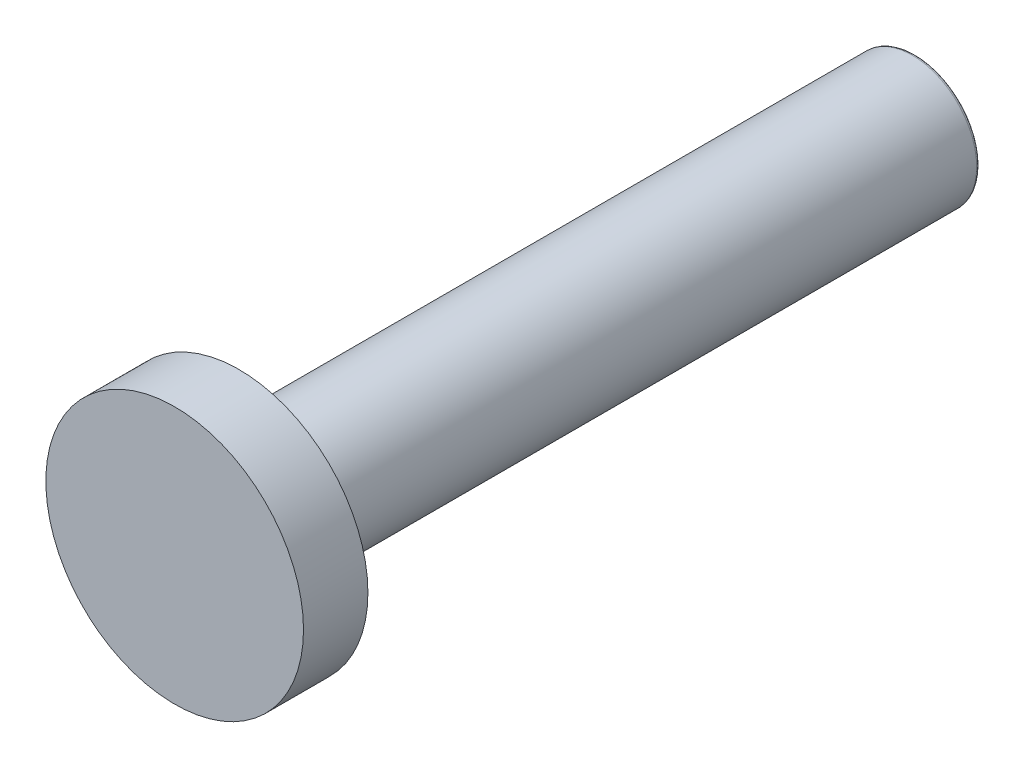
ISO-10303-21;
HEADER;
FILE_DESCRIPTION(('STEP AP214'),'2;1');
FILE_NAME('part.step','',(''),(''),'','','');
FILE_SCHEMA(('AUTOMOTIVE_DESIGN { 1 0 10303 214 1 1 1 1 }'));
ENDSEC;
DATA;
#1=APPLICATION_CONTEXT('core data for automotive mechanical design processes');
#2=APPLICATION_PROTOCOL_DEFINITION('international standard','automotive_design',2000,#1);
#3=PRODUCT_CONTEXT('',#1,'mechanical');
#4=PRODUCT('Part','Part','',(#3));
#5=PRODUCT_RELATED_PRODUCT_CATEGORY('part','',(#4));
#6=PRODUCT_DEFINITION_FORMATION('','',#4);
#7=PRODUCT_DEFINITION_CONTEXT('part definition',#1,'design');
#8=PRODUCT_DEFINITION('design','',#6,#7);
#9=PRODUCT_DEFINITION_SHAPE('','',#8);
#10=(LENGTH_UNIT() NAMED_UNIT(*) SI_UNIT(.MILLI.,.METRE.));
#11=(NAMED_UNIT(*) PLANE_ANGLE_UNIT() SI_UNIT($,.RADIAN.));
#12=(NAMED_UNIT(*) SI_UNIT($,.STERADIAN.) SOLID_ANGLE_UNIT());
#13=UNCERTAINTY_MEASURE_WITH_UNIT(LENGTH_MEASURE(1.E-05),#10,'distance_accuracy_value','');
#14=(GEOMETRIC_REPRESENTATION_CONTEXT(3) GLOBAL_UNCERTAINTY_ASSIGNED_CONTEXT((#13)) GLOBAL_UNIT_ASSIGNED_CONTEXT((#10,
#11,#12)) REPRESENTATION_CONTEXT('',''));
#15=CARTESIAN_POINT('',(0.,0.,0.));
#16=DIRECTION('',(0.,0.,1.));
#17=DIRECTION('',(1.,0.,0.));
#18=AXIS2_PLACEMENT_3D('',#15,#16,#17);
#19=CARTESIAN_POINT('',(0.,0.,0.0947368421052631));
#20=DIRECTION('',(0.,0.,1.));
#21=DIRECTION('',(1.,0.,0.));
#22=AXIS2_PLACEMENT_3D('',#19,#20,#21);
#23=TOROIDAL_SURFACE('',#22,1.8,0.0947368421052631);
#24=CARTESIAN_POINT('',(0.,0.,0.));
#25=DIRECTION('',(0.,0.,1.));
#26=DIRECTION('',(1.,0.,0.));
#27=AXIS2_PLACEMENT_3D('',#24,#25,#26);
#28=CIRCLE('',#27,1.8);
#29=CARTESIAN_POINT('',(1.8,0.,0.));
#30=VERTEX_POINT('',#29);
#31=EDGE_CURVE('E10',#30,#30,#28,.T.);
#32=ORIENTED_EDGE('',*,*,#31,.T.);
#33=EDGE_LOOP('',(#32));
#34=FACE_BOUND('',#33,.T.);
#35=CARTESIAN_POINT('',(0.,0.,0.0947368421052631));
#36=DIRECTION('',(0.,0.,1.));
#37=DIRECTION('',(1.,0.,0.));
#38=AXIS2_PLACEMENT_3D('',#35,#36,#37);
#39=CIRCLE('',#38,1.89473684210526);
#40=CARTESIAN_POINT('',(1.89473684210526,0.,0.0947368421052631));
#41=VERTEX_POINT('',#40);
#42=EDGE_CURVE('E66',#41,#41,#39,.T.);
#43=ORIENTED_EDGE('',*,*,#42,.F.);
#44=EDGE_LOOP('',(#43));
#45=FACE_BOUND('',#44,.T.);
#46=ADVANCED_FACE('F43',(#34,#45),#23,.T.);
#47=CARTESIAN_POINT('',(1.8,0.,0.));
#48=DIRECTION('',(0.,0.,-1.));
#49=DIRECTION('',(-1.,0.,0.));
#50=AXIS2_PLACEMENT_3D('',#47,#48,#49);
#51=PLANE('',#50);
#52=ORIENTED_EDGE('',*,*,#31,.F.);
#53=EDGE_LOOP('',(#52));
#54=FACE_BOUND('',#53,.T.);
#55=ADVANCED_FACE('F75',(#54),#51,.T.);
#56=CARTESIAN_POINT('',(0.,0.,21.7894736842105));
#57=DIRECTION('',(0.,0.,1.));
#58=DIRECTION('',(1.,0.,0.));
#59=AXIS2_PLACEMENT_3D('',#56,#57,#58);
#60=PLANE('',#59);
#61=CARTESIAN_POINT('',(0.,0.,21.7894736842105));
#62=DIRECTION('',(0.,0.,1.));
#63=DIRECTION('',(1.,0.,0.));
#64=AXIS2_PLACEMENT_3D('',#61,#62,#63);
#65=CIRCLE('',#64,3.78947368421053);
#66=CARTESIAN_POINT('',(3.78947368421053,0.,21.7894736842105));
#67=VERTEX_POINT('',#66);
#68=EDGE_CURVE('E50',#67,#67,#65,.T.);
#69=ORIENTED_EDGE('',*,*,#68,.T.);
#70=EDGE_LOOP('',(#69));
#71=FACE_BOUND('',#70,.T.);
#72=ADVANCED_FACE('F79',(#71),#60,.T.);
#73=CARTESIAN_POINT('',(0.,0.,0.));
#74=DIRECTION('',(0.,0.,1.));
#75=DIRECTION('',(1.,0.,0.));
#76=AXIS2_PLACEMENT_3D('',#73,#74,#75);
#77=CYLINDRICAL_SURFACE('',#76,3.78947368421053);
#78=CARTESIAN_POINT('',(0.,0.,19.8947368421053));
#79=DIRECTION('',(0.,0.,1.));
#80=DIRECTION('',(1.,0.,0.));
#81=AXIS2_PLACEMENT_3D('',#78,#79,#80);
#82=CIRCLE('',#81,3.78947368421053);
#83=CARTESIAN_POINT('',(3.78947368421053,0.,19.8947368421053));
#84=VERTEX_POINT('',#83);
#85=EDGE_CURVE('E55',#84,#84,#82,.T.);
#86=ORIENTED_EDGE('',*,*,#85,.T.);
#87=EDGE_LOOP('',(#86));
#88=FACE_BOUND('',#87,.T.);
#89=ORIENTED_EDGE('',*,*,#68,.F.);
#90=EDGE_LOOP('',(#89));
#91=FACE_BOUND('',#90,.T.);
#92=ADVANCED_FACE('F84',(#88,#91),#77,.T.);
#93=CARTESIAN_POINT('',(3.78947368421053,0.,19.8947368421053));
#94=DIRECTION('',(0.,0.,-1.));
#95=DIRECTION('',(-1.,0.,0.));
#96=AXIS2_PLACEMENT_3D('',#93,#94,#95);
#97=PLANE('',#96);
#98=CARTESIAN_POINT('',(0.,0.,19.8947368421053));
#99=DIRECTION('',(0.,0.,1.));
#100=DIRECTION('',(1.,0.,0.));
#101=AXIS2_PLACEMENT_3D('',#98,#99,#100);
#102=CIRCLE('',#101,1.89473684210526);
#103=CARTESIAN_POINT('',(1.89473684210526,0.,19.8947368421053));
#104=VERTEX_POINT('',#103);
#105=EDGE_CURVE('E60',#104,#104,#102,.T.);
#106=ORIENTED_EDGE('',*,*,#105,.T.);
#107=EDGE_LOOP('',(#106));
#108=FACE_BOUND('',#107,.T.);
#109=ORIENTED_EDGE('',*,*,#85,.F.);
#110=EDGE_LOOP('',(#109));
#111=FACE_BOUND('',#110,.T.);
#112=ADVANCED_FACE('F89',(#108,#111),#97,.T.);
#113=CARTESIAN_POINT('',(0.,0.,0.));
#114=DIRECTION('',(0.,0.,1.));
#115=DIRECTION('',(1.,0.,0.));
#116=AXIS2_PLACEMENT_3D('',#113,#114,#115);
#117=CYLINDRICAL_SURFACE('',#116,1.89473684210526);
#118=ORIENTED_EDGE('',*,*,#42,.T.);
#119=EDGE_LOOP('',(#118));
#120=FACE_BOUND('',#119,.T.);
#121=ORIENTED_EDGE('',*,*,#105,.F.);
#122=EDGE_LOOP('',(#121));
#123=FACE_BOUND('',#122,.T.);
#124=ADVANCED_FACE('F71',(#120,#123),#117,.T.);
#125=CLOSED_SHELL('',(#46,#55,#72,#92,#112,#124));
#126=MANIFOLD_SOLID_BREP('B2',#125);
#127=ADVANCED_BREP_SHAPE_REPRESENTATION('',(#18,#126),#14);
#128=SHAPE_DEFINITION_REPRESENTATION(#9,#127);
ENDSEC;
END-ISO-10303-21;
